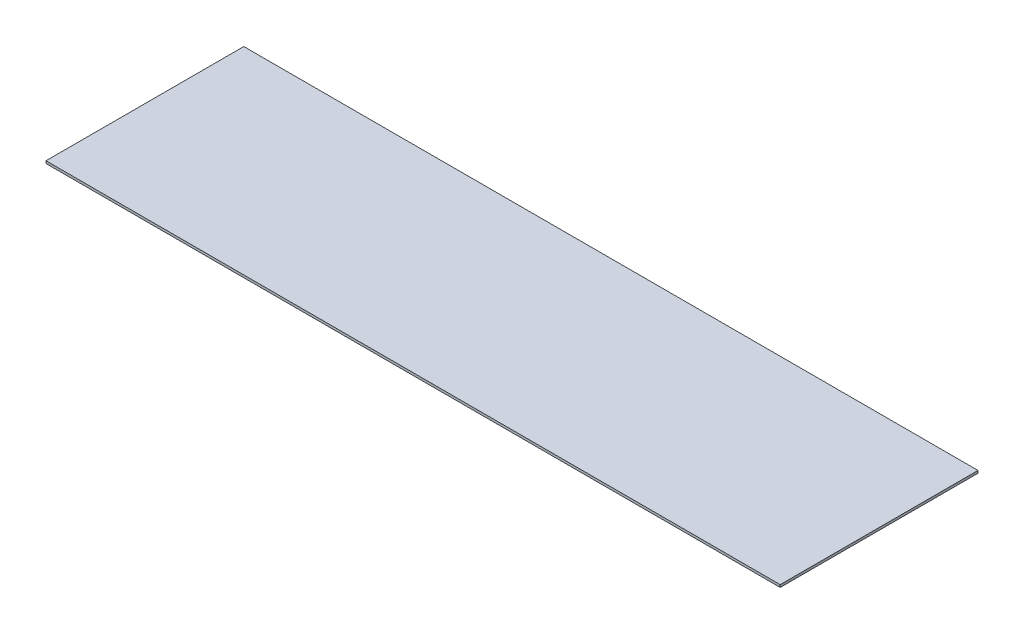
ISO-10303-21;
HEADER;
FILE_DESCRIPTION(('STEP AP214'),'2;1');
FILE_NAME('part.step','',(''),(''),'','','');
FILE_SCHEMA(('AUTOMOTIVE_DESIGN { 1 0 10303 214 1 1 1 1 }'));
ENDSEC;
DATA;
#1=APPLICATION_CONTEXT('core data for automotive mechanical design processes');
#2=APPLICATION_PROTOCOL_DEFINITION('international standard','automotive_design',2000,#1);
#3=PRODUCT_CONTEXT('',#1,'mechanical');
#4=PRODUCT('Part','Part','',(#3));
#5=PRODUCT_RELATED_PRODUCT_CATEGORY('part','',(#4));
#6=PRODUCT_DEFINITION_FORMATION('','',#4);
#7=PRODUCT_DEFINITION_CONTEXT('part definition',#1,'design');
#8=PRODUCT_DEFINITION('design','',#6,#7);
#9=PRODUCT_DEFINITION_SHAPE('','',#8);
#10=(LENGTH_UNIT() NAMED_UNIT(*) SI_UNIT(.MILLI.,.METRE.));
#11=(NAMED_UNIT(*) PLANE_ANGLE_UNIT() SI_UNIT($,.RADIAN.));
#12=(NAMED_UNIT(*) SI_UNIT($,.STERADIAN.) SOLID_ANGLE_UNIT());
#13=UNCERTAINTY_MEASURE_WITH_UNIT(LENGTH_MEASURE(1.E-05),#10,'distance_accuracy_value','');
#14=(GEOMETRIC_REPRESENTATION_CONTEXT(3) GLOBAL_UNCERTAINTY_ASSIGNED_CONTEXT((#13)) GLOBAL_UNIT_ASSIGNED_CONTEXT((#10,
#11,#12)) REPRESENTATION_CONTEXT('',''));
#15=CARTESIAN_POINT('',(0.,0.,0.));
#16=DIRECTION('',(0.,0.,1.));
#17=DIRECTION('',(1.,0.,0.));
#18=AXIS2_PLACEMENT_3D('',#15,#16,#17);
#19=CARTESIAN_POINT('',(75.,0.5,-20.205));
#20=DIRECTION('',(-1.,0.,0.));
#21=DIRECTION('',(0.,0.,1.));
#22=AXIS2_PLACEMENT_3D('',#19,#20,#21);
#23=PLANE('',#22);
#24=DIRECTION('',(0.,0.,-1.));
#25=VECTOR('',#24,1.);
#26=CARTESIAN_POINT('',(75.,0.,-20.205));
#27=LINE('',#26,#25);
#28=CARTESIAN_POINT('',(75.,0.,20.205));
#29=VERTEX_POINT('',#28);
#30=CARTESIAN_POINT('',(75.,0.,-20.205));
#31=VERTEX_POINT('',#30);
#32=EDGE_CURVE('E107',#29,#31,#27,.T.);
#33=ORIENTED_EDGE('',*,*,#32,.T.);
#34=DIRECTION('',(0.,-1.,0.));
#35=VECTOR('',#34,1.);
#36=CARTESIAN_POINT('',(75.,0.5,-20.205));
#37=LINE('',#36,#35);
#38=CARTESIAN_POINT('',(75.,0.5,-20.205));
#39=VERTEX_POINT('',#38);
#40=EDGE_CURVE('E11',#39,#31,#37,.T.);
#41=ORIENTED_EDGE('',*,*,#40,.F.);
#42=DIRECTION('',(0.,0.,-1.));
#43=VECTOR('',#42,1.);
#44=CARTESIAN_POINT('',(75.,0.5,-20.205));
#45=LINE('',#44,#43);
#46=CARTESIAN_POINT('',(75.,0.5,20.205));
#47=VERTEX_POINT('',#46);
#48=EDGE_CURVE('E91',#47,#39,#45,.T.);
#49=ORIENTED_EDGE('',*,*,#48,.F.);
#50=DIRECTION('',(0.,-1.,0.));
#51=VECTOR('',#50,1.);
#52=CARTESIAN_POINT('',(75.,0.5,20.205));
#53=LINE('',#52,#51);
#54=EDGE_CURVE('E103',#47,#29,#53,.T.);
#55=ORIENTED_EDGE('',*,*,#54,.T.);
#56=EDGE_LOOP('',(#33,#41,#49,#55));
#57=FACE_BOUND('',#56,.T.);
#58=ADVANCED_FACE('F39',(#57),#23,.F.);
#59=CARTESIAN_POINT('',(-75.,0.5,-20.205));
#60=DIRECTION('',(0.,0.,1.));
#61=DIRECTION('',(1.,0.,0.));
#62=AXIS2_PLACEMENT_3D('',#59,#60,#61);
#63=PLANE('',#62);
#64=DIRECTION('',(-1.,0.,0.));
#65=VECTOR('',#64,1.);
#66=CARTESIAN_POINT('',(-75.,0.,-20.205));
#67=LINE('',#66,#65);
#68=CARTESIAN_POINT('',(-75.,0.,-20.205));
#69=VERTEX_POINT('',#68);
#70=EDGE_CURVE('E96',#31,#69,#67,.T.);
#71=ORIENTED_EDGE('',*,*,#70,.T.);
#72=DIRECTION('',(0.,-1.,0.));
#73=VECTOR('',#72,1.);
#74=CARTESIAN_POINT('',(-75.,0.5,-20.205));
#75=LINE('',#74,#73);
#76=CARTESIAN_POINT('',(-75.,0.5,-20.205));
#77=VERTEX_POINT('',#76);
#78=EDGE_CURVE('E48',#77,#69,#75,.T.);
#79=ORIENTED_EDGE('',*,*,#78,.F.);
#80=DIRECTION('',(-1.,0.,0.));
#81=VECTOR('',#80,1.);
#82=CARTESIAN_POINT('',(-75.,0.5,-20.205));
#83=LINE('',#82,#81);
#84=EDGE_CURVE('E86',#39,#77,#83,.T.);
#85=ORIENTED_EDGE('',*,*,#84,.F.);
#86=ORIENTED_EDGE('',*,*,#40,.T.);
#87=EDGE_LOOP('',(#71,#79,#85,#86));
#88=FACE_BOUND('',#87,.T.);
#89=ADVANCED_FACE('F95',(#88),#63,.F.);
#90=CARTESIAN_POINT('',(-75.,0.5,-20.205));
#91=DIRECTION('',(1.,0.,0.));
#92=DIRECTION('',(0.,0.,-1.));
#93=AXIS2_PLACEMENT_3D('',#90,#91,#92);
#94=PLANE('',#93);
#95=DIRECTION('',(0.,0.,1.));
#96=VECTOR('',#95,1.);
#97=CARTESIAN_POINT('',(-75.,0.,-20.205));
#98=LINE('',#97,#96);
#99=CARTESIAN_POINT('',(-75.,0.,20.205));
#100=VERTEX_POINT('',#99);
#101=EDGE_CURVE('E73',#69,#100,#98,.T.);
#102=ORIENTED_EDGE('',*,*,#101,.T.);
#103=DIRECTION('',(0.,-1.,0.));
#104=VECTOR('',#103,1.);
#105=CARTESIAN_POINT('',(-75.,0.5,20.205));
#106=LINE('',#105,#104);
#107=CARTESIAN_POINT('',(-75.,0.5,20.205));
#108=VERTEX_POINT('',#107);
#109=EDGE_CURVE('E98',#108,#100,#106,.T.);
#110=ORIENTED_EDGE('',*,*,#109,.F.);
#111=DIRECTION('',(0.,0.,1.));
#112=VECTOR('',#111,1.);
#113=CARTESIAN_POINT('',(-75.,0.5,-20.205));
#114=LINE('',#113,#112);
#115=EDGE_CURVE('E89',#77,#108,#114,.T.);
#116=ORIENTED_EDGE('',*,*,#115,.F.);
#117=ORIENTED_EDGE('',*,*,#78,.T.);
#118=EDGE_LOOP('',(#102,#110,#116,#117));
#119=FACE_BOUND('',#118,.T.);
#120=ADVANCED_FACE('F99',(#119),#94,.F.);
#121=CARTESIAN_POINT('',(-75.,0.5,20.205));
#122=DIRECTION('',(0.,0.,-1.));
#123=DIRECTION('',(-1.,0.,0.));
#124=AXIS2_PLACEMENT_3D('',#121,#122,#123);
#125=PLANE('',#124);
#126=DIRECTION('',(1.,0.,0.));
#127=VECTOR('',#126,1.);
#128=CARTESIAN_POINT('',(-75.,0.,20.205));
#129=LINE('',#128,#127);
#130=EDGE_CURVE('E79',#100,#29,#129,.T.);
#131=ORIENTED_EDGE('',*,*,#130,.T.);
#132=ORIENTED_EDGE('',*,*,#54,.F.);
#133=DIRECTION('',(1.,0.,0.));
#134=VECTOR('',#133,1.);
#135=CARTESIAN_POINT('',(-75.,0.5,20.205));
#136=LINE('',#135,#134);
#137=EDGE_CURVE('E56',#108,#47,#136,.T.);
#138=ORIENTED_EDGE('',*,*,#137,.F.);
#139=ORIENTED_EDGE('',*,*,#109,.T.);
#140=EDGE_LOOP('',(#131,#132,#138,#139));
#141=FACE_BOUND('',#140,.T.);
#142=ADVANCED_FACE('F120',(#141),#125,.F.);
#143=CARTESIAN_POINT('',(0.,0.5,0.));
#144=DIRECTION('',(0.,1.,0.));
#145=DIRECTION('',(0.,0.,1.));
#146=AXIS2_PLACEMENT_3D('',#143,#144,#145);
#147=PLANE('',#146);
#148=ORIENTED_EDGE('',*,*,#48,.T.);
#149=ORIENTED_EDGE('',*,*,#84,.T.);
#150=ORIENTED_EDGE('',*,*,#115,.T.);
#151=ORIENTED_EDGE('',*,*,#137,.T.);
#152=EDGE_LOOP('',(#148,#149,#150,#151));
#153=FACE_BOUND('',#152,.T.);
#154=ADVANCED_FACE('F87',(#153),#147,.T.);
#155=CARTESIAN_POINT('',(0.,0.,0.));
#156=DIRECTION('',(0.,1.,0.));
#157=DIRECTION('',(0.,0.,1.));
#158=AXIS2_PLACEMENT_3D('',#155,#156,#157);
#159=PLANE('',#158);
#160=ORIENTED_EDGE('',*,*,#32,.F.);
#161=ORIENTED_EDGE('',*,*,#130,.F.);
#162=ORIENTED_EDGE('',*,*,#101,.F.);
#163=ORIENTED_EDGE('',*,*,#70,.F.);
#164=EDGE_LOOP('',(#160,#161,#162,#163));
#165=FACE_BOUND('',#164,.T.);
#166=ADVANCED_FACE('F123',(#165),#159,.F.);
#167=CLOSED_SHELL('',(#58,#89,#120,#142,#154,#166));
#168=MANIFOLD_SOLID_BREP('B2',#167);
#169=ADVANCED_BREP_SHAPE_REPRESENTATION('',(#18,#168),#14);
#170=SHAPE_DEFINITION_REPRESENTATION(#9,#169);
ENDSEC;
END-ISO-10303-21;
